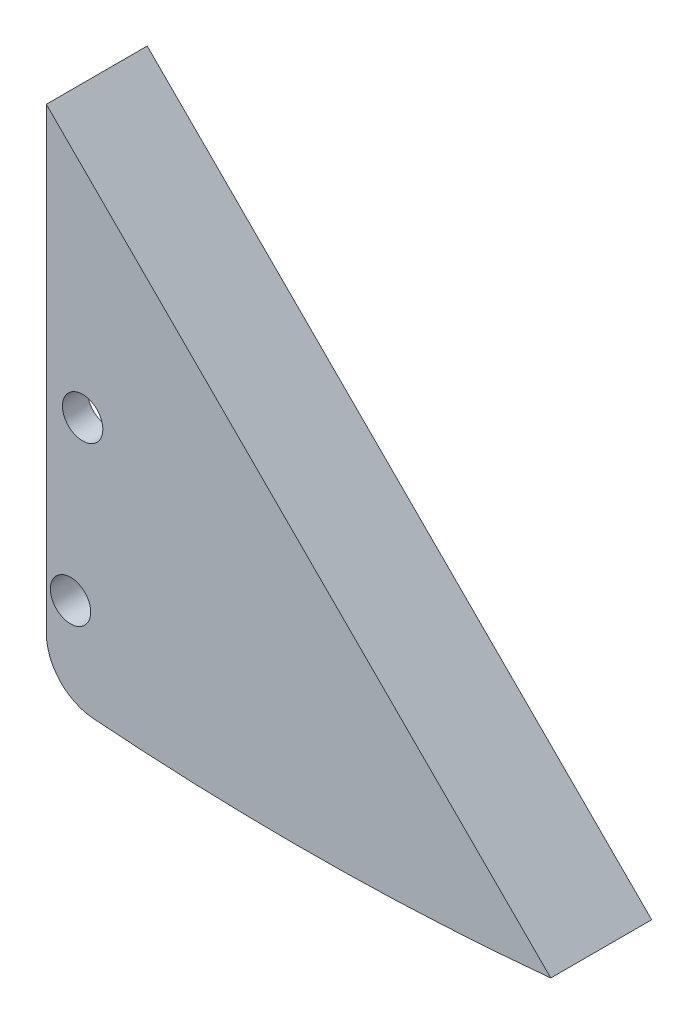
ISO-10303-21;
HEADER;
FILE_DESCRIPTION(('STEP AP214'),'2;1');
FILE_NAME('part.step','',(''),(''),'','','');
FILE_SCHEMA(('AUTOMOTIVE_DESIGN { 1 0 10303 214 1 1 1 1 }'));
ENDSEC;
DATA;
#1=APPLICATION_CONTEXT('core data for automotive mechanical design processes');
#2=APPLICATION_PROTOCOL_DEFINITION('international standard','automotive_design',2000,#1);
#3=PRODUCT_CONTEXT('',#1,'mechanical');
#4=PRODUCT('Part','Part','',(#3));
#5=PRODUCT_RELATED_PRODUCT_CATEGORY('part','',(#4));
#6=PRODUCT_DEFINITION_FORMATION('','',#4);
#7=PRODUCT_DEFINITION_CONTEXT('part definition',#1,'design');
#8=PRODUCT_DEFINITION('design','',#6,#7);
#9=PRODUCT_DEFINITION_SHAPE('','',#8);
#10=(LENGTH_UNIT() NAMED_UNIT(*) SI_UNIT(.MILLI.,.METRE.));
#11=(NAMED_UNIT(*) PLANE_ANGLE_UNIT() SI_UNIT($,.RADIAN.));
#12=(NAMED_UNIT(*) SI_UNIT($,.STERADIAN.) SOLID_ANGLE_UNIT());
#13=UNCERTAINTY_MEASURE_WITH_UNIT(LENGTH_MEASURE(1.E-05),#10,'distance_accuracy_value','');
#14=(GEOMETRIC_REPRESENTATION_CONTEXT(3) GLOBAL_UNCERTAINTY_ASSIGNED_CONTEXT((#13)) GLOBAL_UNIT_ASSIGNED_CONTEXT((#10,
#11,#12)) REPRESENTATION_CONTEXT('',''));
#15=CARTESIAN_POINT('',(0.,0.,0.));
#16=DIRECTION('',(0.,0.,1.));
#17=DIRECTION('',(1.,0.,0.));
#18=AXIS2_PLACEMENT_3D('',#15,#16,#17);
#19=CARTESIAN_POINT('',(25.,-25.,5.));
#20=DIRECTION('',(-0.707106781186548,-0.707106781186548,0.));
#21=DIRECTION('',(0.707106781186548,-0.707106781186548,0.));
#22=AXIS2_PLACEMENT_3D('',#19,#20,#21);
#23=PLANE('',#22);
#24=DIRECTION('',(-0.707106781186547,0.707106781186547,0.));
#25=VECTOR('',#24,1.);
#26=CARTESIAN_POINT('',(25.,-25.,0.));
#27=LINE('',#26,#25);
#28=CARTESIAN_POINT('',(25.,-25.,0.));
#29=VERTEX_POINT('',#28);
#30=CARTESIAN_POINT('',(0.,0.,0.));
#31=VERTEX_POINT('',#30);
#32=EDGE_CURVE('E149',#29,#31,#27,.T.);
#33=ORIENTED_EDGE('',*,*,#32,.T.);
#34=DIRECTION('',(0.,0.,-1.));
#35=VECTOR('',#34,1.);
#36=CARTESIAN_POINT('',(0.,0.,5.));
#37=LINE('',#36,#35);
#38=CARTESIAN_POINT('',(0.,0.,5.));
#39=VERTEX_POINT('',#38);
#40=EDGE_CURVE('E191',#39,#31,#37,.T.);
#41=ORIENTED_EDGE('',*,*,#40,.F.);
#42=DIRECTION('',(-0.707106781186547,0.707106781186547,0.));
#43=VECTOR('',#42,1.);
#44=CARTESIAN_POINT('',(25.,-25.,5.));
#45=LINE('',#44,#43);
#46=CARTESIAN_POINT('',(25.,-25.,5.));
#47=VERTEX_POINT('',#46);
#48=EDGE_CURVE('E152',#47,#39,#45,.T.);
#49=ORIENTED_EDGE('',*,*,#48,.F.);
#50=DIRECTION('',(0.,0.,-1.));
#51=VECTOR('',#50,1.);
#52=CARTESIAN_POINT('',(25.,-25.,5.));
#53=LINE('',#52,#51);
#54=EDGE_CURVE('E163',#47,#29,#53,.T.);
#55=ORIENTED_EDGE('',*,*,#54,.T.);
#56=EDGE_LOOP('',(#33,#41,#49,#55));
#57=FACE_BOUND('',#56,.T.);
#58=ADVANCED_FACE('F39',(#57),#23,.F.);
#59=CARTESIAN_POINT('',(0.,0.,5.));
#60=DIRECTION('',(1.,0.,0.));
#61=DIRECTION('',(0.,1.,0.));
#62=AXIS2_PLACEMENT_3D('',#59,#60,#61);
#63=PLANE('',#62);
#64=DIRECTION('',(0.,1.,0.));
#65=VECTOR('',#64,1.);
#66=CARTESIAN_POINT('',(0.,-7.9,3.75119927547374));
#67=LINE('',#66,#65);
#68=CARTESIAN_POINT('',(0.,-17.2,3.75119927547374));
#69=VERTEX_POINT('',#68);
#70=CARTESIAN_POINT('',(0.,-7.9,3.75119927547374));
#71=VERTEX_POINT('',#70);
#72=EDGE_CURVE('E136',#69,#71,#67,.T.);
#73=ORIENTED_EDGE('',*,*,#72,.F.);
#74=DIRECTION('',(0.,0.,1.));
#75=VECTOR('',#74,1.);
#76=CARTESIAN_POINT('',(0.,-17.2,3.75119927547374));
#77=LINE('',#76,#75);
#78=CARTESIAN_POINT('',(0.,-17.2,1.25119927547374));
#79=VERTEX_POINT('',#78);
#80=EDGE_CURVE('E55',#79,#69,#77,.T.);
#81=ORIENTED_EDGE('',*,*,#80,.F.);
#82=DIRECTION('',(0.,-1.,0.));
#83=VECTOR('',#82,1.);
#84=CARTESIAN_POINT('',(0.,-17.2,1.25119927547374));
#85=LINE('',#84,#83);
#86=CARTESIAN_POINT('',(0.,-7.9,1.25119927547374));
#87=VERTEX_POINT('',#86);
#88=EDGE_CURVE('E124',#87,#79,#85,.T.);
#89=ORIENTED_EDGE('',*,*,#88,.F.);
#90=DIRECTION('',(0.,0.,-1.));
#91=VECTOR('',#90,1.);
#92=CARTESIAN_POINT('',(0.,-7.9,3.75119927547374));
#93=LINE('',#92,#91);
#94=EDGE_CURVE('E127',#71,#87,#93,.T.);
#95=ORIENTED_EDGE('',*,*,#94,.F.);
#96=EDGE_LOOP('',(#73,#81,#89,#95));
#97=FACE_BOUND('',#96,.T.);
#98=DIRECTION('',(0.,-1.,0.));
#99=VECTOR('',#98,1.);
#100=CARTESIAN_POINT('',(0.,0.,0.));
#101=LINE('',#100,#99);
#102=CARTESIAN_POINT('',(0.,-22.7044220292871,0.));
#103=VERTEX_POINT('',#102);
#104=EDGE_CURVE('E195',#31,#103,#101,.T.);
#105=ORIENTED_EDGE('',*,*,#104,.T.);
#106=DIRECTION('',(0.,0.,-1.));
#107=VECTOR('',#106,1.);
#108=CARTESIAN_POINT('',(0.,-22.7044220292871,5.));
#109=LINE('',#108,#107);
#110=CARTESIAN_POINT('',(0.,-22.7044220292871,5.));
#111=VERTEX_POINT('',#110);
#112=EDGE_CURVE('E48',#103,#111,#109,.F.);
#113=ORIENTED_EDGE('',*,*,#112,.T.);
#114=DIRECTION('',(0.,-1.,0.));
#115=VECTOR('',#114,1.);
#116=CARTESIAN_POINT('',(0.,0.,5.));
#117=LINE('',#116,#115);
#118=EDGE_CURVE('E155',#39,#111,#117,.T.);
#119=ORIENTED_EDGE('',*,*,#118,.F.);
#120=ORIENTED_EDGE('',*,*,#40,.T.);
#121=EDGE_LOOP('',(#105,#113,#119,#120));
#122=FACE_BOUND('',#121,.T.);
#123=ADVANCED_FACE('F174',(#97,#122),#63,.F.);
#124=CARTESIAN_POINT('',(0.,-25.,5.));
#125=CARTESIAN_POINT('',(12.5951254480592,-26.1829892619421,5.));
#126=CARTESIAN_POINT('',(25.,-25.,5.));
#127=B_SPLINE_CURVE_WITH_KNOTS('',2,(#124,#125,#126),.UNSPECIFIED.,.F.,.F.,(3,3),(0.,
0.59227576783012),.UNSPECIFIED.);
#128=DIRECTION('',(0.,0.,-1.));
#129=VECTOR('',#128,1.);
#130=SURFACE_OF_LINEAR_EXTRUSION('',#127,#129);
#131=CARTESIAN_POINT('',(2.30855512438342,-25.1970810231328,5.));
#132=VERTEX_POINT('',#131);
#133=EDGE_CURVE('E158',#132,#47,#127,.T.);
#134=ORIENTED_EDGE('',*,*,#133,.F.);
#135=DIRECTION('',(0.,0.,-1.));
#136=VECTOR('',#135,1.);
#137=CARTESIAN_POINT('',(2.30855512438342,-25.1970810231328,5.));
#138=LINE('',#137,#136);
#139=CARTESIAN_POINT('',(2.30855512438342,-25.1970810231328,0.));
#140=VERTEX_POINT('',#139);
#141=EDGE_CURVE('E205',#132,#140,#138,.T.);
#142=ORIENTED_EDGE('',*,*,#141,.T.);
#143=CARTESIAN_POINT('',(0.,-25.,0.));
#144=CARTESIAN_POINT('',(12.5951254480592,-26.1829892619421,0.));
#145=CARTESIAN_POINT('',(25.,-25.,0.));
#146=B_SPLINE_CURVE_WITH_KNOTS('',2,(#143,#144,#145),.UNSPECIFIED.,.F.,.F.,(3,3),(0.,
0.59227576783012),.UNSPECIFIED.);
#147=EDGE_CURVE('E156',#140,#29,#146,.T.);
#148=ORIENTED_EDGE('',*,*,#147,.T.);
#149=ORIENTED_EDGE('',*,*,#54,.F.);
#150=EDGE_LOOP('',(#134,#142,#148,#149));
#151=FACE_BOUND('',#150,.T.);
#152=ADVANCED_FACE('F169',(#151),#130,.F.);
#153=CARTESIAN_POINT('',(12.5475627240296,-25.591494630971,5.));
#154=DIRECTION('',(0.,0.,-1.));
#155=DIRECTION('',(-1.,0.,0.));
#156=AXIS2_PLACEMENT_3D('',#153,#154,#155);
#157=PLANE('',#156);
#158=CARTESIAN_POINT('',(1.8,-12.55,5.));
#159=DIRECTION('',(0.,0.,-1.));
#160=DIRECTION('',(-1.,0.,0.));
#161=AXIS2_PLACEMENT_3D('',#158,#159,#160);
#162=CIRCLE('',#161,1.);
#163=CARTESIAN_POINT('',(0.8,-12.55,5.));
#164=VERTEX_POINT('',#163);
#165=EDGE_CURVE('E130',#164,#164,#162,.T.);
#166=ORIENTED_EDGE('',*,*,#165,.T.);
#167=EDGE_LOOP('',(#166));
#168=FACE_BOUND('',#167,.T.);
#169=CARTESIAN_POINT('',(1.2,-20.7,5.));
#170=DIRECTION('',(0.,0.,1.));
#171=DIRECTION('',(1.,0.,0.));
#172=AXIS2_PLACEMENT_3D('',#169,#170,#171);
#173=CIRCLE('',#172,1.);
#174=CARTESIAN_POINT('',(2.2,-20.7,5.));
#175=VERTEX_POINT('',#174);
#176=EDGE_CURVE('E142',#175,#175,#173,.T.);
#177=ORIENTED_EDGE('',*,*,#176,.F.);
#178=EDGE_LOOP('',(#177));
#179=FACE_BOUND('',#178,.T.);
#180=ORIENTED_EDGE('',*,*,#118,.T.);
#181=CARTESIAN_POINT('',(2.5,-22.7044220292871,5.));
#182=DIRECTION('',(0.,0.,-1.));
#183=DIRECTION('',(-1.,0.,0.));
#184=AXIS2_PLACEMENT_3D('',#181,#182,#183);
#185=CIRCLE('',#184,2.5);
#186=EDGE_CURVE('E11',#111,#132,#185,.F.);
#187=ORIENTED_EDGE('',*,*,#186,.T.);
#188=ORIENTED_EDGE('',*,*,#133,.T.);
#189=ORIENTED_EDGE('',*,*,#48,.T.);
#190=EDGE_LOOP('',(#180,#187,#188,#189));
#191=FACE_BOUND('',#190,.T.);
#192=ADVANCED_FACE('F173',(#168,#179,#191),#157,.F.);
#193=CARTESIAN_POINT('',(12.5475627240296,-25.591494630971,0.));
#194=DIRECTION('',(0.,0.,-1.));
#195=DIRECTION('',(-1.,0.,0.));
#196=AXIS2_PLACEMENT_3D('',#193,#194,#195);
#197=PLANE('',#196);
#198=CARTESIAN_POINT('',(1.8,-12.55,0.));
#199=DIRECTION('',(0.,0.,1.));
#200=DIRECTION('',(1.,0.,0.));
#201=AXIS2_PLACEMENT_3D('',#198,#199,#200);
#202=CIRCLE('',#201,1.);
#203=CARTESIAN_POINT('',(2.8,-12.55,0.));
#204=VERTEX_POINT('',#203);
#205=EDGE_CURVE('E257',#204,#204,#202,.T.);
#206=ORIENTED_EDGE('',*,*,#205,.T.);
#207=EDGE_LOOP('',(#206));
#208=FACE_BOUND('',#207,.T.);
#209=CARTESIAN_POINT('',(1.2,-20.7,0.));
#210=DIRECTION('',(0.,0.,1.));
#211=DIRECTION('',(1.,0.,0.));
#212=AXIS2_PLACEMENT_3D('',#209,#210,#211);
#213=CIRCLE('',#212,1.);
#214=CARTESIAN_POINT('',(2.2,-20.7,0.));
#215=VERTEX_POINT('',#214);
#216=EDGE_CURVE('E146',#215,#215,#213,.T.);
#217=ORIENTED_EDGE('',*,*,#216,.T.);
#218=EDGE_LOOP('',(#217));
#219=FACE_BOUND('',#218,.T.);
#220=ORIENTED_EDGE('',*,*,#147,.F.);
#221=CARTESIAN_POINT('',(2.5,-22.7044220292871,0.));
#222=DIRECTION('',(0.,0.,-1.));
#223=DIRECTION('',(-1.,0.,0.));
#224=AXIS2_PLACEMENT_3D('',#221,#222,#223);
#225=CIRCLE('',#224,2.5);
#226=EDGE_CURVE('E208',#140,#103,#225,.T.);
#227=ORIENTED_EDGE('',*,*,#226,.T.);
#228=ORIENTED_EDGE('',*,*,#104,.F.);
#229=ORIENTED_EDGE('',*,*,#32,.F.);
#230=EDGE_LOOP('',(#220,#227,#228,#229));
#231=FACE_BOUND('',#230,.T.);
#232=ADVANCED_FACE('F176',(#208,#219,#231),#197,.T.);
#233=CARTESIAN_POINT('',(1.2,-20.7,0.));
#234=DIRECTION('',(0.,0.,1.));
#235=DIRECTION('',(1.,0.,0.));
#236=AXIS2_PLACEMENT_3D('',#233,#234,#235);
#237=CYLINDRICAL_SURFACE('',#236,1.);
#238=ORIENTED_EDGE('',*,*,#216,.F.);
#239=EDGE_LOOP('',(#238));
#240=FACE_BOUND('',#239,.T.);
#241=ORIENTED_EDGE('',*,*,#176,.T.);
#242=EDGE_LOOP('',(#241));
#243=FACE_BOUND('',#242,.T.);
#244=ADVANCED_FACE('F221',(#240,#243),#237,.F.);
#245=CARTESIAN_POINT('',(2.5,-22.7044220292871,2.5));
#246=DIRECTION('',(0.,0.,-1.));
#247=DIRECTION('',(-1.,0.,0.));
#248=AXIS2_PLACEMENT_3D('',#245,#246,#247);
#249=CYLINDRICAL_SURFACE('',#248,2.5);
#250=ORIENTED_EDGE('',*,*,#186,.F.);
#251=ORIENTED_EDGE('',*,*,#112,.F.);
#252=ORIENTED_EDGE('',*,*,#226,.F.);
#253=ORIENTED_EDGE('',*,*,#141,.F.);
#254=EDGE_LOOP('',(#250,#251,#252,#253));
#255=FACE_BOUND('',#254,.T.);
#256=ADVANCED_FACE('F41',(#255),#249,.T.);
#257=CARTESIAN_POINT('',(4.8,-17.2,3.75119927547374));
#258=DIRECTION('',(0.,-1.,0.));
#259=DIRECTION('',(1.,0.,0.));
#260=AXIS2_PLACEMENT_3D('',#257,#258,#259);
#261=PLANE('',#260);
#262=ORIENTED_EDGE('',*,*,#80,.T.);
#263=DIRECTION('',(-1.,0.,0.));
#264=VECTOR('',#263,1.);
#265=CARTESIAN_POINT('',(4.8,-17.2,3.75119927547374));
#266=LINE('',#265,#264);
#267=CARTESIAN_POINT('',(4.8,-17.2,3.75119927547374));
#268=VERTEX_POINT('',#267);
#269=EDGE_CURVE('E102',#268,#69,#266,.T.);
#270=ORIENTED_EDGE('',*,*,#269,.F.);
#271=DIRECTION('',(0.,0.,1.));
#272=VECTOR('',#271,1.);
#273=CARTESIAN_POINT('',(4.8,-17.2,3.75119927547374));
#274=LINE('',#273,#272);
#275=CARTESIAN_POINT('',(4.8,-17.2,1.25119927547374));
#276=VERTEX_POINT('',#275);
#277=EDGE_CURVE('E106',#276,#268,#274,.T.);
#278=ORIENTED_EDGE('',*,*,#277,.F.);
#279=DIRECTION('',(-1.,0.,0.));
#280=VECTOR('',#279,1.);
#281=CARTESIAN_POINT('',(4.8,-17.2,1.25119927547374));
#282=LINE('',#281,#280);
#283=EDGE_CURVE('E140',#276,#79,#282,.T.);
#284=ORIENTED_EDGE('',*,*,#283,.T.);
#285=EDGE_LOOP('',(#262,#270,#278,#284));
#286=FACE_BOUND('',#285,.T.);
#287=ADVANCED_FACE('F104',(#286),#261,.F.);
#288=CARTESIAN_POINT('',(4.8,-17.2,1.25119927547374));
#289=DIRECTION('',(0.,0.,-1.));
#290=DIRECTION('',(-1.,0.,0.));
#291=AXIS2_PLACEMENT_3D('',#288,#289,#290);
#292=PLANE('',#291);
#293=CARTESIAN_POINT('',(1.8,-12.55,1.25119927547374));
#294=DIRECTION('',(0.,0.,-1.));
#295=DIRECTION('',(-1.,0.,0.));
#296=AXIS2_PLACEMENT_3D('',#293,#294,#295);
#297=CIRCLE('',#296,1.);
#298=CARTESIAN_POINT('',(0.8,-12.55,1.25119927547374));
#299=VERTEX_POINT('',#298);
#300=EDGE_CURVE('E254',#299,#299,#297,.T.);
#301=ORIENTED_EDGE('',*,*,#300,.T.);
#302=EDGE_LOOP('',(#301));
#303=FACE_BOUND('',#302,.T.);
#304=ORIENTED_EDGE('',*,*,#88,.T.);
#305=ORIENTED_EDGE('',*,*,#283,.F.);
#306=DIRECTION('',(0.,-1.,0.));
#307=VECTOR('',#306,1.);
#308=CARTESIAN_POINT('',(4.8,-17.2,1.25119927547374));
#309=LINE('',#308,#307);
#310=CARTESIAN_POINT('',(4.8,-7.9,1.25119927547374));
#311=VERTEX_POINT('',#310);
#312=EDGE_CURVE('E112',#311,#276,#309,.T.);
#313=ORIENTED_EDGE('',*,*,#312,.F.);
#314=DIRECTION('',(-1.,0.,0.));
#315=VECTOR('',#314,1.);
#316=CARTESIAN_POINT('',(4.8,-7.9,1.25119927547374));
#317=LINE('',#316,#315);
#318=EDGE_CURVE('E143',#311,#87,#317,.T.);
#319=ORIENTED_EDGE('',*,*,#318,.T.);
#320=EDGE_LOOP('',(#304,#305,#313,#319));
#321=FACE_BOUND('',#320,.T.);
#322=ADVANCED_FACE('F230',(#303,#321),#292,.F.);
#323=CARTESIAN_POINT('',(4.8,-7.9,3.75119927547374));
#324=DIRECTION('',(0.,1.,0.));
#325=DIRECTION('',(0.,0.,1.));
#326=AXIS2_PLACEMENT_3D('',#323,#324,#325);
#327=PLANE('',#326);
#328=ORIENTED_EDGE('',*,*,#94,.T.);
#329=ORIENTED_EDGE('',*,*,#318,.F.);
#330=DIRECTION('',(0.,0.,-1.));
#331=VECTOR('',#330,1.);
#332=CARTESIAN_POINT('',(4.8,-7.9,3.75119927547374));
#333=LINE('',#332,#331);
#334=CARTESIAN_POINT('',(4.8,-7.9,3.75119927547374));
#335=VERTEX_POINT('',#334);
#336=EDGE_CURVE('E120',#335,#311,#333,.T.);
#337=ORIENTED_EDGE('',*,*,#336,.F.);
#338=DIRECTION('',(-1.,0.,0.));
#339=VECTOR('',#338,1.);
#340=CARTESIAN_POINT('',(4.8,-7.9,3.75119927547374));
#341=LINE('',#340,#339);
#342=EDGE_CURVE('E111',#335,#71,#341,.T.);
#343=ORIENTED_EDGE('',*,*,#342,.T.);
#344=EDGE_LOOP('',(#328,#329,#337,#343));
#345=FACE_BOUND('',#344,.T.);
#346=ADVANCED_FACE('F233',(#345),#327,.F.);
#347=CARTESIAN_POINT('',(4.8,-7.9,3.75119927547374));
#348=DIRECTION('',(0.,0.,1.));
#349=DIRECTION('',(0.,-1.,0.));
#350=AXIS2_PLACEMENT_3D('',#347,#348,#349);
#351=PLANE('',#350);
#352=CARTESIAN_POINT('',(1.8,-12.55,3.75119927547374));
#353=DIRECTION('',(0.,0.,1.));
#354=DIRECTION('',(0.,-1.,0.));
#355=AXIS2_PLACEMENT_3D('',#352,#353,#354);
#356=CIRCLE('',#355,1.);
#357=CARTESIAN_POINT('',(1.8,-13.55,3.75119927547374));
#358=VERTEX_POINT('',#357);
#359=EDGE_CURVE('E43',#358,#358,#356,.T.);
#360=ORIENTED_EDGE('',*,*,#359,.T.);
#361=EDGE_LOOP('',(#360));
#362=FACE_BOUND('',#361,.T.);
#363=ORIENTED_EDGE('',*,*,#72,.T.);
#364=ORIENTED_EDGE('',*,*,#342,.F.);
#365=DIRECTION('',(0.,1.,0.));
#366=VECTOR('',#365,1.);
#367=CARTESIAN_POINT('',(4.8,-7.9,3.75119927547374));
#368=LINE('',#367,#366);
#369=EDGE_CURVE('E115',#268,#335,#368,.T.);
#370=ORIENTED_EDGE('',*,*,#369,.F.);
#371=ORIENTED_EDGE('',*,*,#269,.T.);
#372=EDGE_LOOP('',(#363,#364,#370,#371));
#373=FACE_BOUND('',#372,.T.);
#374=ADVANCED_FACE('F116',(#362,#373),#351,.F.);
#375=CARTESIAN_POINT('',(4.8,0.,0.));
#376=DIRECTION('',(1.,0.,0.));
#377=DIRECTION('',(0.,1.,0.));
#378=AXIS2_PLACEMENT_3D('',#375,#376,#377);
#379=PLANE('',#378);
#380=ORIENTED_EDGE('',*,*,#277,.T.);
#381=ORIENTED_EDGE('',*,*,#369,.T.);
#382=ORIENTED_EDGE('',*,*,#336,.T.);
#383=ORIENTED_EDGE('',*,*,#312,.T.);
#384=EDGE_LOOP('',(#380,#381,#382,#383));
#385=FACE_BOUND('',#384,.T.);
#386=ADVANCED_FACE('F122',(#385),#379,.F.);
#387=CARTESIAN_POINT('',(1.8,-12.55,0.));
#388=DIRECTION('',(0.,0.,1.));
#389=DIRECTION('',(1.,0.,0.));
#390=AXIS2_PLACEMENT_3D('',#387,#388,#389);
#391=CYLINDRICAL_SURFACE('',#390,1.);
#392=ORIENTED_EDGE('',*,*,#359,.F.);
#393=EDGE_LOOP('',(#392));
#394=FACE_BOUND('',#393,.T.);
#395=ORIENTED_EDGE('',*,*,#165,.F.);
#396=EDGE_LOOP('',(#395));
#397=FACE_BOUND('',#396,.T.);
#398=ADVANCED_FACE('F242',(#394,#397),#391,.F.);
#399=ORIENTED_EDGE('',*,*,#205,.F.);
#400=EDGE_LOOP('',(#399));
#401=FACE_BOUND('',#400,.T.);
#402=ORIENTED_EDGE('',*,*,#300,.F.);
#403=EDGE_LOOP('',(#402));
#404=FACE_BOUND('',#403,.T.);
#405=ADVANCED_FACE('F244',(#401,#404),#391,.F.);
#406=CLOSED_SHELL('',(#58,#123,#152,#192,#232,#244,#256,#287,#322,#346,#374,#386,#398,#405));
#407=MANIFOLD_SOLID_BREP('B2',#406);
#408=ADVANCED_BREP_SHAPE_REPRESENTATION('',(#18,#407),#14);
#409=SHAPE_DEFINITION_REPRESENTATION(#9,#408);
ENDSEC;
END-ISO-10303-21;
